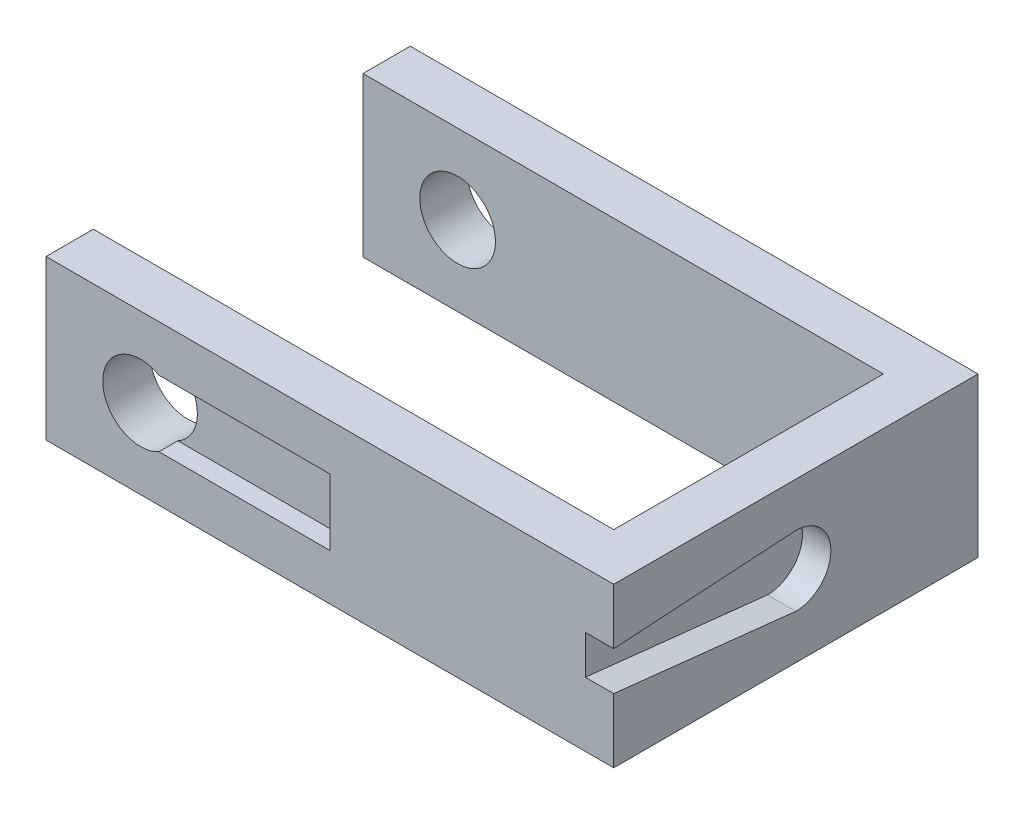
ISO-10303-21;
HEADER;
FILE_DESCRIPTION(('STEP AP214'),'2;1');
FILE_NAME('part.step','',(''),(''),'','','');
FILE_SCHEMA(('AUTOMOTIVE_DESIGN { 1 0 10303 214 1 1 1 1 }'));
ENDSEC;
DATA;
#1=APPLICATION_CONTEXT('core data for automotive mechanical design processes');
#2=APPLICATION_PROTOCOL_DEFINITION('international standard','automotive_design',2000,#1);
#3=PRODUCT_CONTEXT('',#1,'mechanical');
#4=PRODUCT('Part','Part','',(#3));
#5=PRODUCT_RELATED_PRODUCT_CATEGORY('part','',(#4));
#6=PRODUCT_DEFINITION_FORMATION('','',#4);
#7=PRODUCT_DEFINITION_CONTEXT('part definition',#1,'design');
#8=PRODUCT_DEFINITION('design','',#6,#7);
#9=PRODUCT_DEFINITION_SHAPE('','',#8);
#10=(LENGTH_UNIT() NAMED_UNIT(*) SI_UNIT(.MILLI.,.METRE.));
#11=(NAMED_UNIT(*) PLANE_ANGLE_UNIT() SI_UNIT($,.RADIAN.));
#12=(NAMED_UNIT(*) SI_UNIT($,.STERADIAN.) SOLID_ANGLE_UNIT());
#13=UNCERTAINTY_MEASURE_WITH_UNIT(LENGTH_MEASURE(1.E-05),#10,'distance_accuracy_value','');
#14=(GEOMETRIC_REPRESENTATION_CONTEXT(3) GLOBAL_UNCERTAINTY_ASSIGNED_CONTEXT((#13)) GLOBAL_UNIT_ASSIGNED_CONTEXT((#10,
#11,#12)) REPRESENTATION_CONTEXT('',''));
#15=CARTESIAN_POINT('',(0.,0.,0.));
#16=DIRECTION('',(0.,0.,1.));
#17=DIRECTION('',(1.,0.,0.));
#18=AXIS2_PLACEMENT_3D('',#15,#16,#17);
#19=CARTESIAN_POINT('',(2.49999999999999,-16.8,0.));
#20=DIRECTION('',(-1.,0.,0.));
#21=DIRECTION('',(0.,0.,1.));
#22=AXIS2_PLACEMENT_3D('',#19,#20,#21);
#23=PLANE('',#22);
#24=DIRECTION('',(0.,0.107883826700651,0.994163507646717));
#25=VECTOR('',#24,1.);
#26=CARTESIAN_POINT('',(2.49999999999999,-11.9591690672307,1.29777537920994));
#27=LINE('',#26,#25);
#28=CARTESIAN_POINT('',(2.49999999999999,-12.1,0.));
#29=VERTEX_POINT('',#28);
#30=CARTESIAN_POINT('',(2.5,-10.0110441612332,19.25));
#31=VERTEX_POINT('',#30);
#32=EDGE_CURVE('E177',#29,#31,#27,.T.);
#33=ORIENTED_EDGE('',*,*,#32,.T.);
#34=DIRECTION('',(0.,1.,0.));
#35=VECTOR('',#34,1.);
#36=CARTESIAN_POINT('',(2.5,-16.8,19.25));
#37=LINE('',#36,#35);
#38=CARTESIAN_POINT('',(2.5,-16.8,19.25));
#39=VERTEX_POINT('',#38);
#40=EDGE_CURVE('E311',#39,#31,#37,.T.);
#41=ORIENTED_EDGE('',*,*,#40,.F.);
#42=DIRECTION('',(0.,0.,1.));
#43=VECTOR('',#42,1.);
#44=CARTESIAN_POINT('',(2.49999999999999,-16.8,0.));
#45=LINE('',#44,#43);
#46=CARTESIAN_POINT('',(2.5,-16.8,-19.25));
#47=VERTEX_POINT('',#46);
#48=EDGE_CURVE('E266',#47,#39,#45,.T.);
#49=ORIENTED_EDGE('',*,*,#48,.F.);
#50=DIRECTION('',(0.,1.,0.));
#51=VECTOR('',#50,1.);
#52=CARTESIAN_POINT('',(2.5,-16.8,-19.25));
#53=LINE('',#52,#51);
#54=CARTESIAN_POINT('',(2.5,0.,-19.25));
#55=VERTEX_POINT('',#54);
#56=EDGE_CURVE('E309',#47,#55,#53,.T.);
#57=ORIENTED_EDGE('',*,*,#56,.T.);
#58=DIRECTION('',(0.,0.,1.));
#59=VECTOR('',#58,1.);
#60=CARTESIAN_POINT('',(2.49999999999999,0.,0.));
#61=LINE('',#60,#59);
#62=CARTESIAN_POINT('',(2.5,0.,19.25));
#63=VERTEX_POINT('',#62);
#64=EDGE_CURVE('E286',#55,#63,#61,.T.);
#65=ORIENTED_EDGE('',*,*,#64,.T.);
#66=CARTESIAN_POINT('',(2.5,-5.9,19.25));
#67=VERTEX_POINT('',#66);
#68=EDGE_CURVE('E314',#67,#63,#37,.T.);
#69=ORIENTED_EDGE('',*,*,#68,.F.);
#70=DIRECTION('',(0.,0.0622168926220376,-0.99806265247852));
#71=VECTOR('',#70,1.);
#72=CARTESIAN_POINT('',(2.49999999999999,-4.68180657388055,-0.291852877332816));
#73=LINE('',#72,#71);
#74=CARTESIAN_POINT('',(2.49999999999999,-4.7,0.));
#75=VERTEX_POINT('',#74);
#76=EDGE_CURVE('E189',#67,#75,#73,.T.);
#77=ORIENTED_EDGE('',*,*,#76,.T.);
#78=CARTESIAN_POINT('',(2.49999999999999,-8.4,0.));
#79=DIRECTION('',(1.,0.,0.));
#80=DIRECTION('',(0.,0.,-1.));
#81=AXIS2_PLACEMENT_3D('',#78,#79,#80);
#82=CIRCLE('',#81,3.7);
#83=EDGE_CURVE('E198',#29,#75,#82,.T.);
#84=ORIENTED_EDGE('',*,*,#83,.F.);
#85=EDGE_LOOP('',(#33,#41,#49,#57,#65,#69,#77,#84));
#86=FACE_BOUND('',#85,.T.);
#87=ADVANCED_FACE('F34',(#86),#23,.F.);
#88=CARTESIAN_POINT('',(0.,-16.8,19.25));
#89=DIRECTION('',(0.,0.,-1.));
#90=DIRECTION('',(-1.,0.,0.));
#91=AXIS2_PLACEMENT_3D('',#88,#89,#90);
#92=PLANE('',#91);
#93=CARTESIAN_POINT('',(-47.5,-8.40000000000001,19.25));
#94=DIRECTION('',(0.,0.,1.));
#95=DIRECTION('',(1.,0.,0.));
#96=AXIS2_PLACEMENT_3D('',#93,#94,#95);
#97=CIRCLE('',#96,4.00000000000001);
#98=CARTESIAN_POINT('',(-45.5635083268963,-4.9,19.25));
#99=VERTEX_POINT('',#98);
#100=CARTESIAN_POINT('',(-45.5635083268963,-11.9,19.25));
#101=VERTEX_POINT('',#100);
#102=EDGE_CURVE('E242',#99,#101,#97,.T.);
#103=ORIENTED_EDGE('',*,*,#102,.F.);
#104=DIRECTION('',(-1.,0.,0.));
#105=VECTOR('',#104,1.);
#106=CARTESIAN_POINT('',(-27.5,-4.9,19.25));
#107=LINE('',#106,#105);
#108=CARTESIAN_POINT('',(-27.5,-4.9,19.25));
#109=VERTEX_POINT('',#108);
#110=EDGE_CURVE('E229',#109,#99,#107,.T.);
#111=ORIENTED_EDGE('',*,*,#110,.F.);
#112=DIRECTION('',(0.,1.,0.));
#113=VECTOR('',#112,1.);
#114=CARTESIAN_POINT('',(-27.5,-11.9,19.25));
#115=LINE('',#114,#113);
#116=CARTESIAN_POINT('',(-27.5,-11.9,19.25));
#117=VERTEX_POINT('',#116);
#118=EDGE_CURVE('E236',#117,#109,#115,.T.);
#119=ORIENTED_EDGE('',*,*,#118,.F.);
#120=DIRECTION('',(1.,0.,0.));
#121=VECTOR('',#120,1.);
#122=CARTESIAN_POINT('',(-27.5,-11.9,19.25));
#123=LINE('',#122,#121);
#124=EDGE_CURVE('E224',#101,#117,#123,.T.);
#125=ORIENTED_EDGE('',*,*,#124,.F.);
#126=EDGE_LOOP('',(#103,#111,#119,#125));
#127=FACE_BOUND('',#126,.T.);
#128=DIRECTION('',(1.,0.,0.));
#129=VECTOR('',#128,1.);
#130=CARTESIAN_POINT('',(-0.499999999999998,-10.0110441612332,19.25));
#131=LINE('',#130,#129);
#132=CARTESIAN_POINT('',(-0.499999999999998,-10.0110441612332,19.25));
#133=VERTEX_POINT('',#132);
#134=EDGE_CURVE('E202',#133,#31,#131,.T.);
#135=ORIENTED_EDGE('',*,*,#134,.F.);
#136=DIRECTION('',(0.,-1.,0.));
#137=VECTOR('',#136,1.);
#138=CARTESIAN_POINT('',(-0.499999999999998,0.,19.25));
#139=LINE('',#138,#137);
#140=CARTESIAN_POINT('',(-0.499999999999998,-5.9,19.25));
#141=VERTEX_POINT('',#140);
#142=EDGE_CURVE('E183',#141,#133,#139,.T.);
#143=ORIENTED_EDGE('',*,*,#142,.F.);
#144=DIRECTION('',(1.,0.,0.));
#145=VECTOR('',#144,1.);
#146=CARTESIAN_POINT('',(-0.499999999999998,-5.9,19.25));
#147=LINE('',#146,#145);
#148=EDGE_CURVE('E205',#141,#67,#147,.T.);
#149=ORIENTED_EDGE('',*,*,#148,.T.);
#150=ORIENTED_EDGE('',*,*,#68,.T.);
#151=DIRECTION('',(-1.,0.,0.));
#152=VECTOR('',#151,1.);
#153=CARTESIAN_POINT('',(0.,0.,19.25));
#154=LINE('',#153,#152);
#155=CARTESIAN_POINT('',(-57.5,0.,19.25));
#156=VERTEX_POINT('',#155);
#157=EDGE_CURVE('E283',#63,#156,#154,.T.);
#158=ORIENTED_EDGE('',*,*,#157,.T.);
#159=DIRECTION('',(0.,1.,0.));
#160=VECTOR('',#159,1.);
#161=CARTESIAN_POINT('',(-57.5,-16.8,19.25));
#162=LINE('',#161,#160);
#163=CARTESIAN_POINT('',(-57.5,-16.8,19.25));
#164=VERTEX_POINT('',#163);
#165=EDGE_CURVE('E315',#164,#156,#162,.T.);
#166=ORIENTED_EDGE('',*,*,#165,.F.);
#167=DIRECTION('',(-1.,0.,0.));
#168=VECTOR('',#167,1.);
#169=CARTESIAN_POINT('',(0.,-16.8,19.25));
#170=LINE('',#169,#168);
#171=EDGE_CURVE('E264',#39,#164,#170,.T.);
#172=ORIENTED_EDGE('',*,*,#171,.F.);
#173=ORIENTED_EDGE('',*,*,#40,.T.);
#174=EDGE_LOOP('',(#135,#143,#149,#150,#158,#166,#172,#173));
#175=FACE_BOUND('',#174,.T.);
#176=ADVANCED_FACE('F359',(#127,#175),#92,.F.);
#177=CARTESIAN_POINT('',(0.,-16.8,14.25));
#178=DIRECTION('',(0.,0.,-1.));
#179=DIRECTION('',(-1.,0.,0.));
#180=AXIS2_PLACEMENT_3D('',#177,#178,#179);
#181=PLANE('',#180);
#182=CARTESIAN_POINT('',(-47.5,-8.40000000000001,14.25));
#183=DIRECTION('',(0.,0.,-1.));
#184=DIRECTION('',(-1.,0.,0.));
#185=AXIS2_PLACEMENT_3D('',#182,#183,#184);
#186=CIRCLE('',#185,4.00000000000001);
#187=CARTESIAN_POINT('',(-51.5,-8.40000000000001,14.25));
#188=VERTEX_POINT('',#187);
#189=EDGE_CURVE('E253',#188,#188,#186,.T.);
#190=ORIENTED_EDGE('',*,*,#189,.F.);
#191=EDGE_LOOP('',(#190));
#192=FACE_BOUND('',#191,.T.);
#193=DIRECTION('',(-1.,0.,0.));
#194=VECTOR('',#193,1.);
#195=CARTESIAN_POINT('',(0.,0.,14.25));
#196=LINE('',#195,#194);
#197=CARTESIAN_POINT('',(-2.5,0.,14.25));
#198=VERTEX_POINT('',#197);
#199=CARTESIAN_POINT('',(-57.5,0.,14.25));
#200=VERTEX_POINT('',#199);
#201=EDGE_CURVE('E256',#198,#200,#196,.T.);
#202=ORIENTED_EDGE('',*,*,#201,.F.);
#203=DIRECTION('',(0.,1.,0.));
#204=VECTOR('',#203,1.);
#205=CARTESIAN_POINT('',(-2.5,-16.8,14.25));
#206=LINE('',#205,#204);
#207=CARTESIAN_POINT('',(-2.5,-16.8,14.25));
#208=VERTEX_POINT('',#207);
#209=EDGE_CURVE('E298',#208,#198,#206,.T.);
#210=ORIENTED_EDGE('',*,*,#209,.F.);
#211=DIRECTION('',(-1.,0.,0.));
#212=VECTOR('',#211,1.);
#213=CARTESIAN_POINT('',(0.,-16.8,14.25));
#214=LINE('',#213,#212);
#215=CARTESIAN_POINT('',(-57.5,-16.8,14.25));
#216=VERTEX_POINT('',#215);
#217=EDGE_CURVE('E257',#208,#216,#214,.T.);
#218=ORIENTED_EDGE('',*,*,#217,.T.);
#219=DIRECTION('',(0.,1.,0.));
#220=VECTOR('',#219,1.);
#221=CARTESIAN_POINT('',(-57.5,-16.8,14.25));
#222=LINE('',#221,#220);
#223=EDGE_CURVE('E277',#216,#200,#222,.T.);
#224=ORIENTED_EDGE('',*,*,#223,.T.);
#225=EDGE_LOOP('',(#202,#210,#218,#224));
#226=FACE_BOUND('',#225,.T.);
#227=ADVANCED_FACE('F36',(#192,#226),#181,.T.);
#228=CARTESIAN_POINT('',(-2.5,-16.8,0.));
#229=DIRECTION('',(1.,0.,0.));
#230=DIRECTION('',(0.,0.,-1.));
#231=AXIS2_PLACEMENT_3D('',#228,#229,#230);
#232=PLANE('',#231);
#233=DIRECTION('',(0.,0.,-1.));
#234=VECTOR('',#233,1.);
#235=CARTESIAN_POINT('',(-2.5,0.,0.));
#236=LINE('',#235,#234);
#237=CARTESIAN_POINT('',(-2.50000000000001,0.,-14.25));
#238=VERTEX_POINT('',#237);
#239=EDGE_CURVE('E261',#198,#238,#236,.T.);
#240=ORIENTED_EDGE('',*,*,#239,.T.);
#241=DIRECTION('',(0.,1.,0.));
#242=VECTOR('',#241,1.);
#243=CARTESIAN_POINT('',(-2.50000000000001,-16.8,-14.25));
#244=LINE('',#243,#242);
#245=CARTESIAN_POINT('',(-2.50000000000001,-16.8,-14.25));
#246=VERTEX_POINT('',#245);
#247=EDGE_CURVE('E301',#246,#238,#244,.T.);
#248=ORIENTED_EDGE('',*,*,#247,.F.);
#249=DIRECTION('',(0.,0.,-1.));
#250=VECTOR('',#249,1.);
#251=CARTESIAN_POINT('',(-2.5,-16.8,0.));
#252=LINE('',#251,#250);
#253=EDGE_CURVE('E275',#208,#246,#252,.T.);
#254=ORIENTED_EDGE('',*,*,#253,.F.);
#255=ORIENTED_EDGE('',*,*,#209,.T.);
#256=EDGE_LOOP('',(#240,#248,#254,#255));
#257=FACE_BOUND('',#256,.T.);
#258=ADVANCED_FACE('F410',(#257),#232,.F.);
#259=CARTESIAN_POINT('',(0.,-16.8,-14.25));
#260=DIRECTION('',(0.,0.,-1.));
#261=DIRECTION('',(-1.,0.,0.));
#262=AXIS2_PLACEMENT_3D('',#259,#260,#261);
#263=PLANE('',#262);
#264=CARTESIAN_POINT('',(-47.5,-8.40000000000001,-14.25));
#265=DIRECTION('',(0.,0.,-1.));
#266=DIRECTION('',(-1.,0.,0.));
#267=AXIS2_PLACEMENT_3D('',#264,#265,#266);
#268=CIRCLE('',#267,4.00000000000001);
#269=CARTESIAN_POINT('',(-51.5,-8.40000000000001,-14.25));
#270=VERTEX_POINT('',#269);
#271=EDGE_CURVE('E248',#270,#270,#268,.T.);
#272=ORIENTED_EDGE('',*,*,#271,.T.);
#273=EDGE_LOOP('',(#272));
#274=FACE_BOUND('',#273,.T.);
#275=DIRECTION('',(-1.,0.,0.));
#276=VECTOR('',#275,1.);
#277=CARTESIAN_POINT('',(0.,0.,-14.25));
#278=LINE('',#277,#276);
#279=CARTESIAN_POINT('',(-57.5,0.,-14.25));
#280=VERTEX_POINT('',#279);
#281=EDGE_CURVE('E295',#238,#280,#278,.T.);
#282=ORIENTED_EDGE('',*,*,#281,.T.);
#283=DIRECTION('',(0.,1.,0.));
#284=VECTOR('',#283,1.);
#285=CARTESIAN_POINT('',(-57.5,-16.8,-14.25));
#286=LINE('',#285,#284);
#287=CARTESIAN_POINT('',(-57.5,-16.8,-14.25));
#288=VERTEX_POINT('',#287);
#289=EDGE_CURVE('E304',#288,#280,#286,.T.);
#290=ORIENTED_EDGE('',*,*,#289,.F.);
#291=DIRECTION('',(-1.,0.,0.));
#292=VECTOR('',#291,1.);
#293=CARTESIAN_POINT('',(0.,-16.8,-14.25));
#294=LINE('',#293,#292);
#295=EDGE_CURVE('E273',#246,#288,#294,.T.);
#296=ORIENTED_EDGE('',*,*,#295,.F.);
#297=ORIENTED_EDGE('',*,*,#247,.T.);
#298=EDGE_LOOP('',(#282,#290,#296,#297));
#299=FACE_BOUND('',#298,.T.);
#300=ADVANCED_FACE('F407',(#274,#299),#263,.F.);
#301=CARTESIAN_POINT('',(-57.5,-16.8,0.));
#302=DIRECTION('',(1.,0.,0.));
#303=DIRECTION('',(0.,0.,-1.));
#304=AXIS2_PLACEMENT_3D('',#301,#302,#303);
#305=PLANE('',#304);
#306=DIRECTION('',(0.,0.,-1.));
#307=VECTOR('',#306,1.);
#308=CARTESIAN_POINT('',(-57.5,0.,0.));
#309=LINE('',#308,#307);
#310=CARTESIAN_POINT('',(-57.5,0.,-19.25));
#311=VERTEX_POINT('',#310);
#312=EDGE_CURVE('E292',#280,#311,#309,.T.);
#313=ORIENTED_EDGE('',*,*,#312,.T.);
#314=DIRECTION('',(0.,1.,0.));
#315=VECTOR('',#314,1.);
#316=CARTESIAN_POINT('',(-57.5,-16.8,-19.25));
#317=LINE('',#316,#315);
#318=CARTESIAN_POINT('',(-57.5,-16.8,-19.25));
#319=VERTEX_POINT('',#318);
#320=EDGE_CURVE('E307',#319,#311,#317,.T.);
#321=ORIENTED_EDGE('',*,*,#320,.F.);
#322=DIRECTION('',(0.,0.,-1.));
#323=VECTOR('',#322,1.);
#324=CARTESIAN_POINT('',(-57.5,-16.8,0.));
#325=LINE('',#324,#323);
#326=EDGE_CURVE('E271',#288,#319,#325,.T.);
#327=ORIENTED_EDGE('',*,*,#326,.F.);
#328=ORIENTED_EDGE('',*,*,#289,.T.);
#329=EDGE_LOOP('',(#313,#321,#327,#328));
#330=FACE_BOUND('',#329,.T.);
#331=ADVANCED_FACE('F380',(#330),#305,.F.);
#332=CARTESIAN_POINT('',(0.,-16.8,-19.25));
#333=DIRECTION('',(0.,0.,-1.));
#334=DIRECTION('',(-1.,0.,0.));
#335=AXIS2_PLACEMENT_3D('',#332,#333,#334);
#336=PLANE('',#335);
#337=DIRECTION('',(1.,0.,0.));
#338=VECTOR('',#337,1.);
#339=CARTESIAN_POINT('',(-47.5,-4.99297394422291,-19.25));
#340=LINE('',#339,#338);
#341=CARTESIAN_POINT('',(-45.4042487134071,-4.99297394422291,-19.25));
#342=VERTEX_POINT('',#341);
#343=CARTESIAN_POINT('',(-27.5,-4.99297394422291,-19.25));
#344=VERTEX_POINT('',#343);
#345=EDGE_CURVE('E211',#342,#344,#340,.T.);
#346=ORIENTED_EDGE('',*,*,#345,.F.);
#347=CARTESIAN_POINT('',(-47.5,-8.40000000000001,-19.25));
#348=DIRECTION('',(0.,0.,1.));
#349=DIRECTION('',(1.,0.,0.));
#350=AXIS2_PLACEMENT_3D('',#347,#348,#349);
#351=CIRCLE('',#350,4.00000000000001);
#352=CARTESIAN_POINT('',(-45.7420073276218,-11.9929739442229,-19.25));
#353=VERTEX_POINT('',#352);
#354=EDGE_CURVE('E245',#342,#353,#351,.T.);
#355=ORIENTED_EDGE('',*,*,#354,.T.);
#356=DIRECTION('',(-1.,0.,0.));
#357=VECTOR('',#356,1.);
#358=CARTESIAN_POINT('',(-47.5,-11.9929739442229,-19.25));
#359=LINE('',#358,#357);
#360=CARTESIAN_POINT('',(-27.5,-11.9929739442229,-19.25));
#361=VERTEX_POINT('',#360);
#362=EDGE_CURVE('E218',#361,#353,#359,.T.);
#363=ORIENTED_EDGE('',*,*,#362,.F.);
#364=DIRECTION('',(0.,-1.,0.));
#365=VECTOR('',#364,1.);
#366=CARTESIAN_POINT('',(-27.5,-11.9929739442229,-19.25));
#367=LINE('',#366,#365);
#368=EDGE_CURVE('E204',#344,#361,#367,.T.);
#369=ORIENTED_EDGE('',*,*,#368,.F.);
#370=EDGE_LOOP('',(#346,#355,#363,#369));
#371=FACE_BOUND('',#370,.T.);
#372=DIRECTION('',(-1.,0.,0.));
#373=VECTOR('',#372,1.);
#374=CARTESIAN_POINT('',(0.,0.,-19.25));
#375=LINE('',#374,#373);
#376=EDGE_CURVE('E289',#55,#311,#375,.T.);
#377=ORIENTED_EDGE('',*,*,#376,.F.);
#378=ORIENTED_EDGE('',*,*,#56,.F.);
#379=DIRECTION('',(-1.,0.,0.));
#380=VECTOR('',#379,1.);
#381=CARTESIAN_POINT('',(0.,-16.8,-19.25));
#382=LINE('',#381,#380);
#383=EDGE_CURVE('E268',#47,#319,#382,.T.);
#384=ORIENTED_EDGE('',*,*,#383,.T.);
#385=ORIENTED_EDGE('',*,*,#320,.T.);
#386=EDGE_LOOP('',(#377,#378,#384,#385));
#387=FACE_BOUND('',#386,.T.);
#388=ADVANCED_FACE('F336',(#371,#387),#336,.T.);
#389=CARTESIAN_POINT('',(-57.5,-16.8,0.));
#390=DIRECTION('',(-1.,0.,0.));
#391=DIRECTION('',(0.,0.,1.));
#392=AXIS2_PLACEMENT_3D('',#389,#390,#391);
#393=PLANE('',#392);
#394=DIRECTION('',(0.,0.,1.));
#395=VECTOR('',#394,1.);
#396=CARTESIAN_POINT('',(-57.5,0.,0.));
#397=LINE('',#396,#395);
#398=EDGE_CURVE('E280',#200,#156,#397,.T.);
#399=ORIENTED_EDGE('',*,*,#398,.F.);
#400=ORIENTED_EDGE('',*,*,#223,.F.);
#401=DIRECTION('',(0.,0.,1.));
#402=VECTOR('',#401,1.);
#403=CARTESIAN_POINT('',(-57.5,-16.8,0.));
#404=LINE('',#403,#402);
#405=EDGE_CURVE('E260',#216,#164,#404,.T.);
#406=ORIENTED_EDGE('',*,*,#405,.T.);
#407=ORIENTED_EDGE('',*,*,#165,.T.);
#408=EDGE_LOOP('',(#399,#400,#406,#407));
#409=FACE_BOUND('',#408,.T.);
#410=ADVANCED_FACE('F369',(#409),#393,.T.);
#411=CARTESIAN_POINT('',(0.,-16.8,0.));
#412=DIRECTION('',(0.,1.,0.));
#413=DIRECTION('',(0.,0.,1.));
#414=AXIS2_PLACEMENT_3D('',#411,#412,#413);
#415=PLANE('',#414);
#416=ORIENTED_EDGE('',*,*,#217,.F.);
#417=ORIENTED_EDGE('',*,*,#253,.T.);
#418=ORIENTED_EDGE('',*,*,#295,.T.);
#419=ORIENTED_EDGE('',*,*,#326,.T.);
#420=ORIENTED_EDGE('',*,*,#383,.F.);
#421=ORIENTED_EDGE('',*,*,#48,.T.);
#422=ORIENTED_EDGE('',*,*,#171,.T.);
#423=ORIENTED_EDGE('',*,*,#405,.F.);
#424=EDGE_LOOP('',(#416,#417,#418,#419,#420,#421,#422,#423));
#425=FACE_BOUND('',#424,.T.);
#426=ADVANCED_FACE('F371',(#425),#415,.F.);
#427=CARTESIAN_POINT('',(0.,0.,0.));
#428=DIRECTION('',(0.,1.,0.));
#429=DIRECTION('',(0.,0.,1.));
#430=AXIS2_PLACEMENT_3D('',#427,#428,#429);
#431=PLANE('',#430);
#432=ORIENTED_EDGE('',*,*,#201,.T.);
#433=ORIENTED_EDGE('',*,*,#398,.T.);
#434=ORIENTED_EDGE('',*,*,#157,.F.);
#435=ORIENTED_EDGE('',*,*,#64,.F.);
#436=ORIENTED_EDGE('',*,*,#376,.T.);
#437=ORIENTED_EDGE('',*,*,#312,.F.);
#438=ORIENTED_EDGE('',*,*,#281,.F.);
#439=ORIENTED_EDGE('',*,*,#239,.F.);
#440=EDGE_LOOP('',(#432,#433,#434,#435,#436,#437,#438,#439));
#441=FACE_BOUND('',#440,.T.);
#442=ADVANCED_FACE('F377',(#441),#431,.T.);
#443=CARTESIAN_POINT('',(-47.5,-8.40000000000001,-19.25));
#444=DIRECTION('',(0.,0.,1.));
#445=DIRECTION('',(1.,0.,0.));
#446=AXIS2_PLACEMENT_3D('',#443,#444,#445);
#447=CYLINDRICAL_SURFACE('',#446,4.00000000000001);
#448=ORIENTED_EDGE('',*,*,#189,.T.);
#449=EDGE_LOOP('',(#448));
#450=FACE_BOUND('',#449,.T.);
#451=CARTESIAN_POINT('',(-47.5,-8.40000000000001,17.25));
#452=DIRECTION('',(0.,0.,1.));
#453=DIRECTION('',(1.,0.,0.));
#454=AXIS2_PLACEMENT_3D('',#451,#452,#453);
#455=CIRCLE('',#454,4.00000000000001);
#456=CARTESIAN_POINT('',(-45.5635083268963,-4.9,17.25));
#457=VERTEX_POINT('',#456);
#458=CARTESIAN_POINT('',(-45.5635083268963,-11.9,17.25));
#459=VERTEX_POINT('',#458);
#460=EDGE_CURVE('E300',#457,#459,#455,.F.);
#461=ORIENTED_EDGE('',*,*,#460,.F.);
#462=DIRECTION('',(0.,0.,1.));
#463=VECTOR('',#462,1.);
#464=CARTESIAN_POINT('',(-45.5635083268963,-4.9,-19.25));
#465=LINE('',#464,#463);
#466=EDGE_CURVE('E322',#457,#99,#465,.T.);
#467=ORIENTED_EDGE('',*,*,#466,.T.);
#468=ORIENTED_EDGE('',*,*,#102,.T.);
#469=DIRECTION('',(0.,0.,1.));
#470=VECTOR('',#469,1.);
#471=CARTESIAN_POINT('',(-45.5635083268963,-11.9,-19.25));
#472=LINE('',#471,#470);
#473=EDGE_CURVE('E319',#101,#459,#472,.F.);
#474=ORIENTED_EDGE('',*,*,#473,.T.);
#475=EDGE_LOOP('',(#461,#467,#468,#474));
#476=FACE_BOUND('',#475,.T.);
#477=ADVANCED_FACE('F447',(#450,#476),#447,.F.);
#478=ORIENTED_EDGE('',*,*,#354,.F.);
#479=DIRECTION('',(0.,0.,1.));
#480=VECTOR('',#479,1.);
#481=CARTESIAN_POINT('',(-45.4042487134071,-4.99297394422291,-19.25));
#482=LINE('',#481,#480);
#483=CARTESIAN_POINT('',(-45.4042487134071,-4.99297394422291,-17.25));
#484=VERTEX_POINT('',#483);
#485=EDGE_CURVE('E11',#342,#484,#482,.T.);
#486=ORIENTED_EDGE('',*,*,#485,.T.);
#487=CARTESIAN_POINT('',(-47.5,-8.40000000000001,-17.25));
#488=DIRECTION('',(0.,0.,-1.));
#489=DIRECTION('',(-1.,0.,0.));
#490=AXIS2_PLACEMENT_3D('',#487,#488,#489);
#491=CIRCLE('',#490,4.00000000000001);
#492=CARTESIAN_POINT('',(-45.7420073276218,-11.9929739442229,-17.25));
#493=VERTEX_POINT('',#492);
#494=EDGE_CURVE('E325',#493,#484,#491,.F.);
#495=ORIENTED_EDGE('',*,*,#494,.F.);
#496=DIRECTION('',(0.,0.,1.));
#497=VECTOR('',#496,1.);
#498=CARTESIAN_POINT('',(-45.7420073276218,-11.9929739442229,-19.25));
#499=LINE('',#498,#497);
#500=EDGE_CURVE('E42',#493,#353,#499,.F.);
#501=ORIENTED_EDGE('',*,*,#500,.T.);
#502=EDGE_LOOP('',(#478,#486,#495,#501));
#503=FACE_BOUND('',#502,.T.);
#504=ORIENTED_EDGE('',*,*,#271,.F.);
#505=EDGE_LOOP('',(#504));
#506=FACE_BOUND('',#505,.T.);
#507=ADVANCED_FACE('F330',(#503,#506),#447,.F.);
#508=CARTESIAN_POINT('',(-27.5,-4.9,17.25));
#509=DIRECTION('',(0.,1.,0.));
#510=DIRECTION('',(-1.,0.,0.));
#511=AXIS2_PLACEMENT_3D('',#508,#509,#510);
#512=PLANE('',#511);
#513=DIRECTION('',(-1.,0.,0.));
#514=VECTOR('',#513,1.);
#515=CARTESIAN_POINT('',(-27.5,-4.9,17.25));
#516=LINE('',#515,#514);
#517=CARTESIAN_POINT('',(-27.5,-4.9,17.25));
#518=VERTEX_POINT('',#517);
#519=EDGE_CURVE('E232',#518,#457,#516,.T.);
#520=ORIENTED_EDGE('',*,*,#519,.F.);
#521=DIRECTION('',(0.,0.,1.));
#522=VECTOR('',#521,1.);
#523=CARTESIAN_POINT('',(-27.5,-4.9,17.25));
#524=LINE('',#523,#522);
#525=EDGE_CURVE('E240',#518,#109,#524,.T.);
#526=ORIENTED_EDGE('',*,*,#525,.T.);
#527=ORIENTED_EDGE('',*,*,#110,.T.);
#528=ORIENTED_EDGE('',*,*,#466,.F.);
#529=EDGE_LOOP('',(#520,#526,#527,#528));
#530=FACE_BOUND('',#529,.T.);
#531=ADVANCED_FACE('F446',(#530),#512,.F.);
#532=CARTESIAN_POINT('',(-27.5,-11.9,17.25));
#533=DIRECTION('',(0.,-1.,0.));
#534=DIRECTION('',(1.,0.,0.));
#535=AXIS2_PLACEMENT_3D('',#532,#533,#534);
#536=PLANE('',#535);
#537=ORIENTED_EDGE('',*,*,#124,.T.);
#538=DIRECTION('',(0.,0.,1.));
#539=VECTOR('',#538,1.);
#540=CARTESIAN_POINT('',(-27.5,-11.9,17.25));
#541=LINE('',#540,#539);
#542=CARTESIAN_POINT('',(-27.5,-11.9,17.25));
#543=VERTEX_POINT('',#542);
#544=EDGE_CURVE('E234',#543,#117,#541,.T.);
#545=ORIENTED_EDGE('',*,*,#544,.F.);
#546=DIRECTION('',(1.,0.,0.));
#547=VECTOR('',#546,1.);
#548=CARTESIAN_POINT('',(-27.5,-11.9,17.25));
#549=LINE('',#548,#547);
#550=EDGE_CURVE('E226',#459,#543,#549,.T.);
#551=ORIENTED_EDGE('',*,*,#550,.F.);
#552=ORIENTED_EDGE('',*,*,#473,.F.);
#553=EDGE_LOOP('',(#537,#545,#551,#552));
#554=FACE_BOUND('',#553,.T.);
#555=ADVANCED_FACE('F553',(#554),#536,.F.);
#556=CARTESIAN_POINT('',(0.,0.,17.25));
#557=DIRECTION('',(0.,0.,1.));
#558=DIRECTION('',(1.,0.,0.));
#559=AXIS2_PLACEMENT_3D('',#556,#557,#558);
#560=PLANE('',#559);
#561=ORIENTED_EDGE('',*,*,#460,.T.);
#562=ORIENTED_EDGE('',*,*,#550,.T.);
#563=DIRECTION('',(0.,1.,0.));
#564=VECTOR('',#563,1.);
#565=CARTESIAN_POINT('',(-27.5,-11.9,17.25));
#566=LINE('',#565,#564);
#567=EDGE_CURVE('E228',#543,#518,#566,.T.);
#568=ORIENTED_EDGE('',*,*,#567,.T.);
#569=ORIENTED_EDGE('',*,*,#519,.T.);
#570=EDGE_LOOP('',(#561,#562,#568,#569));
#571=FACE_BOUND('',#570,.T.);
#572=ADVANCED_FACE('F562',(#571),#560,.T.);
#573=CARTESIAN_POINT('',(-27.5,-11.9,17.25));
#574=DIRECTION('',(1.,0.,0.));
#575=DIRECTION('',(0.,0.,-1.));
#576=AXIS2_PLACEMENT_3D('',#573,#574,#575);
#577=PLANE('',#576);
#578=ORIENTED_EDGE('',*,*,#118,.T.);
#579=ORIENTED_EDGE('',*,*,#525,.F.);
#580=ORIENTED_EDGE('',*,*,#567,.F.);
#581=ORIENTED_EDGE('',*,*,#544,.T.);
#582=EDGE_LOOP('',(#578,#579,#580,#581));
#583=FACE_BOUND('',#582,.T.);
#584=ADVANCED_FACE('F437',(#583),#577,.F.);
#585=CARTESIAN_POINT('',(-47.5,-4.99297394422291,-17.25));
#586=DIRECTION('',(0.,1.,0.));
#587=DIRECTION('',(-1.,0.,0.));
#588=AXIS2_PLACEMENT_3D('',#585,#586,#587);
#589=PLANE('',#588);
#590=ORIENTED_EDGE('',*,*,#345,.T.);
#591=DIRECTION('',(0.,0.,-1.));
#592=VECTOR('',#591,1.);
#593=CARTESIAN_POINT('',(-27.5,-4.99297394422291,-17.25));
#594=LINE('',#593,#592);
#595=CARTESIAN_POINT('',(-27.5,-4.99297394422291,-17.25));
#596=VERTEX_POINT('',#595);
#597=EDGE_CURVE('E221',#596,#344,#594,.T.);
#598=ORIENTED_EDGE('',*,*,#597,.F.);
#599=DIRECTION('',(1.,0.,0.));
#600=VECTOR('',#599,1.);
#601=CARTESIAN_POINT('',(-47.5,-4.99297394422291,-17.25));
#602=LINE('',#601,#600);
#603=EDGE_CURVE('E213',#484,#596,#602,.T.);
#604=ORIENTED_EDGE('',*,*,#603,.F.);
#605=ORIENTED_EDGE('',*,*,#485,.F.);
#606=EDGE_LOOP('',(#590,#598,#604,#605));
#607=FACE_BOUND('',#606,.T.);
#608=ADVANCED_FACE('F341',(#607),#589,.F.);
#609=CARTESIAN_POINT('',(-47.5,-11.9929739442229,-17.25));
#610=DIRECTION('',(0.,-1.,0.));
#611=DIRECTION('',(1.,0.,0.));
#612=AXIS2_PLACEMENT_3D('',#609,#610,#611);
#613=PLANE('',#612);
#614=DIRECTION('',(-1.,0.,0.));
#615=VECTOR('',#614,1.);
#616=CARTESIAN_POINT('',(-47.5,-11.9929739442229,-17.25));
#617=LINE('',#616,#615);
#618=CARTESIAN_POINT('',(-27.5,-11.9929739442229,-17.25));
#619=VERTEX_POINT('',#618);
#620=EDGE_CURVE('E57',#619,#493,#617,.T.);
#621=ORIENTED_EDGE('',*,*,#620,.F.);
#622=DIRECTION('',(0.,0.,-1.));
#623=VECTOR('',#622,1.);
#624=CARTESIAN_POINT('',(-27.5,-11.9929739442229,-17.25));
#625=LINE('',#624,#623);
#626=EDGE_CURVE('E215',#619,#361,#625,.T.);
#627=ORIENTED_EDGE('',*,*,#626,.T.);
#628=ORIENTED_EDGE('',*,*,#362,.T.);
#629=ORIENTED_EDGE('',*,*,#500,.F.);
#630=EDGE_LOOP('',(#621,#627,#628,#629));
#631=FACE_BOUND('',#630,.T.);
#632=ADVANCED_FACE('F348',(#631),#613,.F.);
#633=CARTESIAN_POINT('',(0.,0.,-17.25));
#634=DIRECTION('',(0.,0.,-1.));
#635=DIRECTION('',(-1.,0.,0.));
#636=AXIS2_PLACEMENT_3D('',#633,#634,#635);
#637=PLANE('',#636);
#638=ORIENTED_EDGE('',*,*,#494,.T.);
#639=ORIENTED_EDGE('',*,*,#603,.T.);
#640=DIRECTION('',(0.,-1.,0.));
#641=VECTOR('',#640,1.);
#642=CARTESIAN_POINT('',(-27.5,-11.9929739442229,-17.25));
#643=LINE('',#642,#641);
#644=EDGE_CURVE('E209',#596,#619,#643,.T.);
#645=ORIENTED_EDGE('',*,*,#644,.T.);
#646=ORIENTED_EDGE('',*,*,#620,.T.);
#647=EDGE_LOOP('',(#638,#639,#645,#646));
#648=FACE_BOUND('',#647,.T.);
#649=ADVANCED_FACE('F346',(#648),#637,.T.);
#650=CARTESIAN_POINT('',(-27.5,-11.9929739442229,-17.25));
#651=DIRECTION('',(1.,0.,0.));
#652=DIRECTION('',(0.,0.,-1.));
#653=AXIS2_PLACEMENT_3D('',#650,#651,#652);
#654=PLANE('',#653);
#655=ORIENTED_EDGE('',*,*,#368,.T.);
#656=ORIENTED_EDGE('',*,*,#626,.F.);
#657=ORIENTED_EDGE('',*,*,#644,.F.);
#658=ORIENTED_EDGE('',*,*,#597,.T.);
#659=EDGE_LOOP('',(#655,#656,#657,#658));
#660=FACE_BOUND('',#659,.T.);
#661=ADVANCED_FACE('F345',(#660),#654,.F.);
#662=CARTESIAN_POINT('',(-0.500000000000012,-11.9591690672307,1.29777537920994));
#663=DIRECTION('',(0.,0.994163507646717,-0.107883826700651));
#664=DIRECTION('',(0.,0.107883826700651,0.994163507646717));
#665=AXIS2_PLACEMENT_3D('',#662,#663,#664);
#666=PLANE('',#665);
#667=ORIENTED_EDGE('',*,*,#32,.F.);
#668=DIRECTION('',(1.,0.,0.));
#669=VECTOR('',#668,1.);
#670=CARTESIAN_POINT('',(-0.500000000000013,-12.1,0.));
#671=LINE('',#670,#669);
#672=CARTESIAN_POINT('',(-0.500000000000013,-12.1,0.));
#673=VERTEX_POINT('',#672);
#674=EDGE_CURVE('E172',#673,#29,#671,.T.);
#675=ORIENTED_EDGE('',*,*,#674,.F.);
#676=DIRECTION('',(0.,0.107883826700651,0.994163507646717));
#677=VECTOR('',#676,1.);
#678=CARTESIAN_POINT('',(-0.500000000000012,-11.9591690672307,1.29777537920994));
#679=LINE('',#678,#677);
#680=EDGE_CURVE('E175',#673,#133,#679,.T.);
#681=ORIENTED_EDGE('',*,*,#680,.T.);
#682=ORIENTED_EDGE('',*,*,#134,.T.);
#683=EDGE_LOOP('',(#667,#675,#681,#682));
#684=FACE_BOUND('',#683,.T.);
#685=ADVANCED_FACE('F174',(#684),#666,.T.);
#686=CARTESIAN_POINT('',(-0.500000000000013,-4.68180657388055,-0.291852877332813));
#687=DIRECTION('',(0.,-0.998062652478519,-0.0622168926220376));
#688=DIRECTION('',(0.,0.0622168926220376,-0.998062652478519));
#689=AXIS2_PLACEMENT_3D('',#686,#687,#688);
#690=PLANE('',#689);
#691=ORIENTED_EDGE('',*,*,#76,.F.);
#692=ORIENTED_EDGE('',*,*,#148,.F.);
#693=DIRECTION('',(0.,0.0622168926220376,-0.99806265247852));
#694=VECTOR('',#693,1.);
#695=CARTESIAN_POINT('',(-0.500000000000013,-4.68180657388055,-0.291852877332813));
#696=LINE('',#695,#694);
#697=CARTESIAN_POINT('',(-0.500000000000013,-4.7,0.));
#698=VERTEX_POINT('',#697);
#699=EDGE_CURVE('E49',#141,#698,#696,.T.);
#700=ORIENTED_EDGE('',*,*,#699,.T.);
#701=DIRECTION('',(1.,0.,0.));
#702=VECTOR('',#701,1.);
#703=CARTESIAN_POINT('',(-0.500000000000013,-4.7,0.));
#704=LINE('',#703,#702);
#705=EDGE_CURVE('E182',#698,#75,#704,.T.);
#706=ORIENTED_EDGE('',*,*,#705,.T.);
#707=EDGE_LOOP('',(#691,#692,#700,#706));
#708=FACE_BOUND('',#707,.T.);
#709=ADVANCED_FACE('F495',(#708),#690,.T.);
#710=CARTESIAN_POINT('',(-0.500000000000013,-8.4,0.));
#711=DIRECTION('',(1.,0.,0.));
#712=DIRECTION('',(0.,0.,-1.));
#713=AXIS2_PLACEMENT_3D('',#710,#711,#712);
#714=CYLINDRICAL_SURFACE('',#713,3.7);
#715=ORIENTED_EDGE('',*,*,#83,.T.);
#716=ORIENTED_EDGE('',*,*,#705,.F.);
#717=CARTESIAN_POINT('',(-0.500000000000013,-8.4,0.));
#718=DIRECTION('',(1.,0.,0.));
#719=DIRECTION('',(0.,0.,-1.));
#720=AXIS2_PLACEMENT_3D('',#717,#718,#719);
#721=CIRCLE('',#720,3.7);
#722=EDGE_CURVE('E186',#673,#698,#721,.T.);
#723=ORIENTED_EDGE('',*,*,#722,.F.);
#724=ORIENTED_EDGE('',*,*,#674,.T.);
#725=EDGE_LOOP('',(#715,#716,#723,#724));
#726=FACE_BOUND('',#725,.T.);
#727=ADVANCED_FACE('F192',(#726),#714,.F.);
#728=CARTESIAN_POINT('',(-0.500000000000013,0.,0.));
#729=DIRECTION('',(1.,0.,0.));
#730=DIRECTION('',(0.,0.,-1.));
#731=AXIS2_PLACEMENT_3D('',#728,#729,#730);
#732=PLANE('',#731);
#733=ORIENTED_EDGE('',*,*,#680,.F.);
#734=ORIENTED_EDGE('',*,*,#722,.T.);
#735=ORIENTED_EDGE('',*,*,#699,.F.);
#736=ORIENTED_EDGE('',*,*,#142,.T.);
#737=EDGE_LOOP('',(#733,#734,#735,#736));
#738=FACE_BOUND('',#737,.T.);
#739=ADVANCED_FACE('F185',(#738),#732,.T.);
#740=CLOSED_SHELL('',(#87,#176,#227,#258,#300,#331,#388,#410,#426,#442,#477,#507,#531,#555,#572,
#584,#608,#632,#649,#661,#685,#709,#727,#739));
#741=MANIFOLD_SOLID_BREP('B2',#740);
#742=ADVANCED_BREP_SHAPE_REPRESENTATION('',(#18,#741),#14);
#743=SHAPE_DEFINITION_REPRESENTATION(#9,#742);
ENDSEC;
END-ISO-10303-21;
